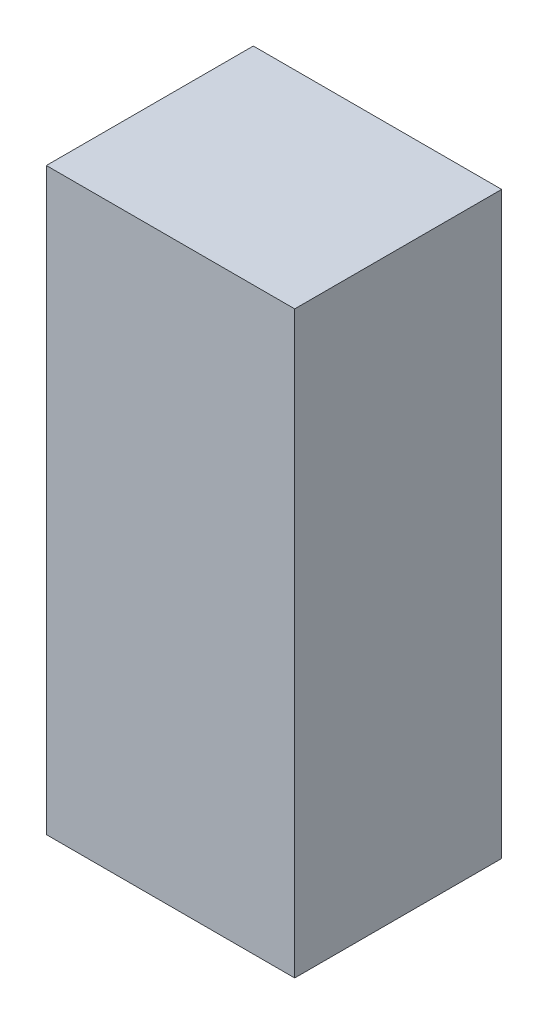
ISO-10303-21;
HEADER;
FILE_DESCRIPTION(('STEP AP214'),'2;1');
FILE_NAME('part.step','',(''),(''),'','','');
FILE_SCHEMA(('AUTOMOTIVE_DESIGN { 1 0 10303 214 1 1 1 1 }'));
ENDSEC;
DATA;
#1=APPLICATION_CONTEXT('core data for automotive mechanical design processes');
#2=APPLICATION_PROTOCOL_DEFINITION('international standard','automotive_design',2000,#1);
#3=PRODUCT_CONTEXT('',#1,'mechanical');
#4=PRODUCT('Part','Part','',(#3));
#5=PRODUCT_RELATED_PRODUCT_CATEGORY('part','',(#4));
#6=PRODUCT_DEFINITION_FORMATION('','',#4);
#7=PRODUCT_DEFINITION_CONTEXT('part definition',#1,'design');
#8=PRODUCT_DEFINITION('design','',#6,#7);
#9=PRODUCT_DEFINITION_SHAPE('','',#8);
#10=(LENGTH_UNIT() NAMED_UNIT(*) SI_UNIT(.MILLI.,.METRE.));
#11=(NAMED_UNIT(*) PLANE_ANGLE_UNIT() SI_UNIT($,.RADIAN.));
#12=(NAMED_UNIT(*) SI_UNIT($,.STERADIAN.) SOLID_ANGLE_UNIT());
#13=UNCERTAINTY_MEASURE_WITH_UNIT(LENGTH_MEASURE(1.E-05),#10,'distance_accuracy_value','');
#14=(GEOMETRIC_REPRESENTATION_CONTEXT(3) GLOBAL_UNCERTAINTY_ASSIGNED_CONTEXT((#13)) GLOBAL_UNIT_ASSIGNED_CONTEXT((#10,
#11,#12)) REPRESENTATION_CONTEXT('',''));
#15=CARTESIAN_POINT('',(0.,0.,0.));
#16=DIRECTION('',(0.,0.,1.));
#17=DIRECTION('',(1.,0.,0.));
#18=AXIS2_PLACEMENT_3D('',#15,#16,#17);
#19=CARTESIAN_POINT('',(6.,14.,-10.));
#20=DIRECTION('',(1.,0.,0.));
#21=DIRECTION('',(0.,1.,0.));
#22=AXIS2_PLACEMENT_3D('',#19,#20,#21);
#23=PLANE('',#22);
#24=DIRECTION('',(0.,1.,0.));
#25=VECTOR('',#24,1.);
#26=CARTESIAN_POINT('',(6.,14.,0.));
#27=LINE('',#26,#25);
#28=CARTESIAN_POINT('',(6.,-14.,0.));
#29=VERTEX_POINT('',#28);
#30=CARTESIAN_POINT('',(6.,14.,0.));
#31=VERTEX_POINT('',#30);
#32=EDGE_CURVE('E103',#29,#31,#27,.T.);
#33=ORIENTED_EDGE('',*,*,#32,.F.);
#34=DIRECTION('',(0.,0.,1.));
#35=VECTOR('',#34,1.);
#36=CARTESIAN_POINT('',(6.,-14.,-10.));
#37=LINE('',#36,#35);
#38=CARTESIAN_POINT('',(6.,-14.,-10.));
#39=VERTEX_POINT('',#38);
#40=EDGE_CURVE('E11',#39,#29,#37,.T.);
#41=ORIENTED_EDGE('',*,*,#40,.F.);
#42=DIRECTION('',(0.,1.,0.));
#43=VECTOR('',#42,1.);
#44=CARTESIAN_POINT('',(6.,14.,-10.));
#45=LINE('',#44,#43);
#46=CARTESIAN_POINT('',(6.,14.,-10.));
#47=VERTEX_POINT('',#46);
#48=EDGE_CURVE('E97',#39,#47,#45,.T.);
#49=ORIENTED_EDGE('',*,*,#48,.T.);
#50=DIRECTION('',(0.,0.,1.));
#51=VECTOR('',#50,1.);
#52=CARTESIAN_POINT('',(6.,14.,-10.));
#53=LINE('',#52,#51);
#54=EDGE_CURVE('E42',#47,#31,#53,.T.);
#55=ORIENTED_EDGE('',*,*,#54,.T.);
#56=EDGE_LOOP('',(#33,#41,#49,#55));
#57=FACE_BOUND('',#56,.T.);
#58=ADVANCED_FACE('F39',(#57),#23,.T.);
#59=CARTESIAN_POINT('',(-6.,-14.,-10.));
#60=DIRECTION('',(0.,-1.,0.));
#61=DIRECTION('',(0.,0.,-1.));
#62=AXIS2_PLACEMENT_3D('',#59,#60,#61);
#63=PLANE('',#62);
#64=DIRECTION('',(1.,0.,0.));
#65=VECTOR('',#64,1.);
#66=CARTESIAN_POINT('',(-6.,-14.,0.));
#67=LINE('',#66,#65);
#68=CARTESIAN_POINT('',(-6.,-14.,0.));
#69=VERTEX_POINT('',#68);
#70=EDGE_CURVE('E99',#69,#29,#67,.T.);
#71=ORIENTED_EDGE('',*,*,#70,.F.);
#72=DIRECTION('',(0.,0.,1.));
#73=VECTOR('',#72,1.);
#74=CARTESIAN_POINT('',(-6.,-14.,-10.));
#75=LINE('',#74,#73);
#76=CARTESIAN_POINT('',(-6.,-14.,-10.));
#77=VERTEX_POINT('',#76);
#78=EDGE_CURVE('E48',#77,#69,#75,.T.);
#79=ORIENTED_EDGE('',*,*,#78,.F.);
#80=DIRECTION('',(1.,0.,0.));
#81=VECTOR('',#80,1.);
#82=CARTESIAN_POINT('',(-6.,-14.,-10.));
#83=LINE('',#82,#81);
#84=EDGE_CURVE('E94',#77,#39,#83,.T.);
#85=ORIENTED_EDGE('',*,*,#84,.T.);
#86=ORIENTED_EDGE('',*,*,#40,.T.);
#87=EDGE_LOOP('',(#71,#79,#85,#86));
#88=FACE_BOUND('',#87,.T.);
#89=ADVANCED_FACE('F113',(#88),#63,.T.);
#90=CARTESIAN_POINT('',(-6.,14.,-10.));
#91=DIRECTION('',(-1.,0.,0.));
#92=DIRECTION('',(0.,-1.,0.));
#93=AXIS2_PLACEMENT_3D('',#90,#91,#92);
#94=PLANE('',#93);
#95=DIRECTION('',(0.,-1.,0.));
#96=VECTOR('',#95,1.);
#97=CARTESIAN_POINT('',(-6.,14.,0.));
#98=LINE('',#97,#96);
#99=CARTESIAN_POINT('',(-6.,14.,0.));
#100=VERTEX_POINT('',#99);
#101=EDGE_CURVE('E89',#100,#69,#98,.T.);
#102=ORIENTED_EDGE('',*,*,#101,.F.);
#103=DIRECTION('',(0.,0.,1.));
#104=VECTOR('',#103,1.);
#105=CARTESIAN_POINT('',(-6.,14.,-10.));
#106=LINE('',#105,#104);
#107=CARTESIAN_POINT('',(-6.,14.,-10.));
#108=VERTEX_POINT('',#107);
#109=EDGE_CURVE('E84',#108,#100,#106,.T.);
#110=ORIENTED_EDGE('',*,*,#109,.F.);
#111=DIRECTION('',(0.,-1.,0.));
#112=VECTOR('',#111,1.);
#113=CARTESIAN_POINT('',(-6.,14.,-10.));
#114=LINE('',#113,#112);
#115=EDGE_CURVE('E87',#108,#77,#114,.T.);
#116=ORIENTED_EDGE('',*,*,#115,.T.);
#117=ORIENTED_EDGE('',*,*,#78,.T.);
#118=EDGE_LOOP('',(#102,#110,#116,#117));
#119=FACE_BOUND('',#118,.T.);
#120=ADVANCED_FACE('F86',(#119),#94,.T.);
#121=CARTESIAN_POINT('',(-6.,14.,-10.));
#122=DIRECTION('',(0.,1.,0.));
#123=DIRECTION('',(0.,0.,1.));
#124=AXIS2_PLACEMENT_3D('',#121,#122,#123);
#125=PLANE('',#124);
#126=DIRECTION('',(-1.,0.,0.));
#127=VECTOR('',#126,1.);
#128=CARTESIAN_POINT('',(-6.,14.,0.));
#129=LINE('',#128,#127);
#130=EDGE_CURVE('E106',#31,#100,#129,.T.);
#131=ORIENTED_EDGE('',*,*,#130,.F.);
#132=ORIENTED_EDGE('',*,*,#54,.F.);
#133=DIRECTION('',(-1.,0.,0.));
#134=VECTOR('',#133,1.);
#135=CARTESIAN_POINT('',(-6.,14.,-10.));
#136=LINE('',#135,#134);
#137=EDGE_CURVE('E93',#47,#108,#136,.T.);
#138=ORIENTED_EDGE('',*,*,#137,.T.);
#139=ORIENTED_EDGE('',*,*,#109,.T.);
#140=EDGE_LOOP('',(#131,#132,#138,#139));
#141=FACE_BOUND('',#140,.T.);
#142=ADVANCED_FACE('F96',(#141),#125,.T.);
#143=CARTESIAN_POINT('',(0.,0.,-10.));
#144=DIRECTION('',(0.,0.,1.));
#145=DIRECTION('',(1.,0.,0.));
#146=AXIS2_PLACEMENT_3D('',#143,#144,#145);
#147=PLANE('',#146);
#148=ORIENTED_EDGE('',*,*,#48,.F.);
#149=ORIENTED_EDGE('',*,*,#84,.F.);
#150=ORIENTED_EDGE('',*,*,#115,.F.);
#151=ORIENTED_EDGE('',*,*,#137,.F.);
#152=EDGE_LOOP('',(#148,#149,#150,#151));
#153=FACE_BOUND('',#152,.T.);
#154=ADVANCED_FACE('F92',(#153),#147,.F.);
#155=CARTESIAN_POINT('',(0.,0.,0.));
#156=DIRECTION('',(0.,0.,1.));
#157=DIRECTION('',(1.,0.,0.));
#158=AXIS2_PLACEMENT_3D('',#155,#156,#157);
#159=PLANE('',#158);
#160=ORIENTED_EDGE('',*,*,#32,.T.);
#161=ORIENTED_EDGE('',*,*,#130,.T.);
#162=ORIENTED_EDGE('',*,*,#101,.T.);
#163=ORIENTED_EDGE('',*,*,#70,.T.);
#164=EDGE_LOOP('',(#160,#161,#162,#163));
#165=FACE_BOUND('',#164,.T.);
#166=ADVANCED_FACE('F112',(#165),#159,.T.);
#167=CLOSED_SHELL('',(#58,#89,#120,#142,#154,#166));
#168=MANIFOLD_SOLID_BREP('B2',#167);
#169=ADVANCED_BREP_SHAPE_REPRESENTATION('',(#18,#168),#14);
#170=SHAPE_DEFINITION_REPRESENTATION(#9,#169);
ENDSEC;
END-ISO-10303-21;
